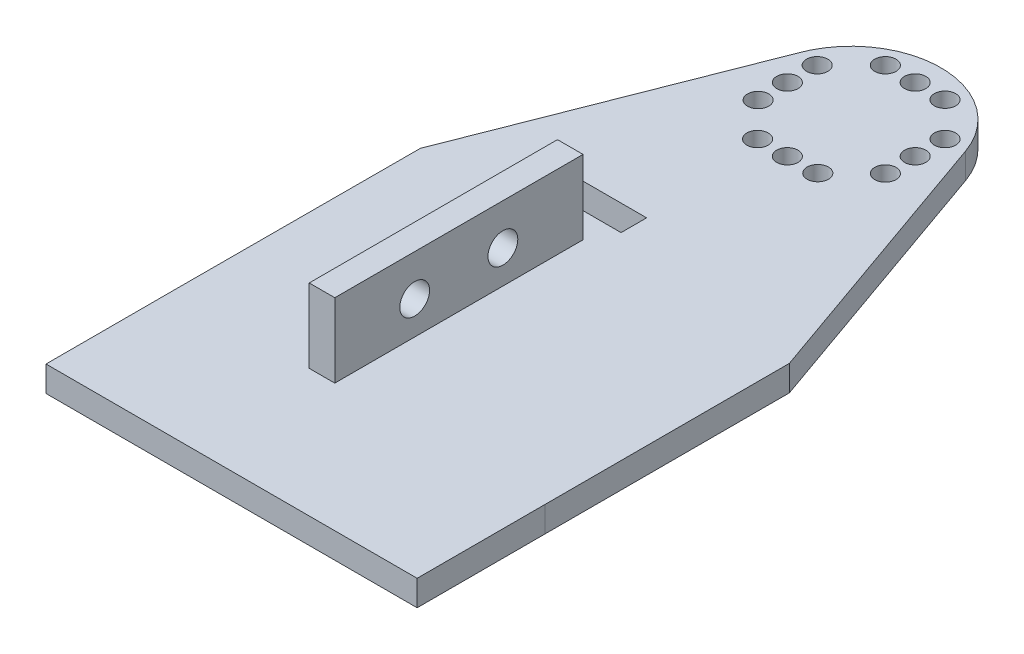
ISO-10303-21;
HEADER;
FILE_DESCRIPTION(('STEP AP214'),'2;1');
FILE_NAME('part.step','',(''),(''),'','','');
FILE_SCHEMA(('AUTOMOTIVE_DESIGN { 1 0 10303 214 1 1 1 1 }'));
ENDSEC;
DATA;
#1=APPLICATION_CONTEXT('core data for automotive mechanical design processes');
#2=APPLICATION_PROTOCOL_DEFINITION('international standard','automotive_design',2000,#1);
#3=PRODUCT_CONTEXT('',#1,'mechanical');
#4=PRODUCT('Part','Part','',(#3));
#5=PRODUCT_RELATED_PRODUCT_CATEGORY('part','',(#4));
#6=PRODUCT_DEFINITION_FORMATION('','',#4);
#7=PRODUCT_DEFINITION_CONTEXT('part definition',#1,'design');
#8=PRODUCT_DEFINITION('design','',#6,#7);
#9=PRODUCT_DEFINITION_SHAPE('','',#8);
#10=(LENGTH_UNIT() NAMED_UNIT(*) SI_UNIT(.MILLI.,.METRE.));
#11=(NAMED_UNIT(*) PLANE_ANGLE_UNIT() SI_UNIT($,.RADIAN.));
#12=(NAMED_UNIT(*) SI_UNIT($,.STERADIAN.) SOLID_ANGLE_UNIT());
#13=UNCERTAINTY_MEASURE_WITH_UNIT(LENGTH_MEASURE(1.E-05),#10,'distance_accuracy_value','');
#14=(GEOMETRIC_REPRESENTATION_CONTEXT(3) GLOBAL_UNCERTAINTY_ASSIGNED_CONTEXT((#13)) GLOBAL_UNIT_ASSIGNED_CONTEXT((#10,
#11,#12)) REPRESENTATION_CONTEXT('',''));
#15=CARTESIAN_POINT('',(0.,0.,0.));
#16=DIRECTION('',(0.,0.,1.));
#17=DIRECTION('',(1.,0.,0.));
#18=AXIS2_PLACEMENT_3D('',#15,#16,#17);
#19=CARTESIAN_POINT('',(21.1626098440634,-3.,4.90120877782623E-05));
#20=DIRECTION('',(-0.999999999997318,0.,-2.31597558804307E-06));
#21=DIRECTION('',(-2.31597558804307E-06,0.,0.999999999997318));
#22=AXIS2_PLACEMENT_3D('',#19,#20,#21);
#23=PLANE('',#22);
#24=DIRECTION('',(-2.31597558804307E-06,0.,0.999999999997318));
#25=VECTOR('',#24,1.);
#26=CARTESIAN_POINT('',(21.1626098440634,0.,4.90120877782623E-05));
#27=LINE('',#26,#25);
#28=CARTESIAN_POINT('',(21.1625440363906,0.,28.4147150215454));
#29=VERTEX_POINT('',#28);
#30=CARTESIAN_POINT('',(21.1624776148512,0.,57.0944384809703));
#31=VERTEX_POINT('',#30);
#32=EDGE_CURVE('E225',#29,#31,#27,.T.);
#33=ORIENTED_EDGE('',*,*,#32,.T.);
#34=DIRECTION('',(0.,1.,0.));
#35=VECTOR('',#34,1.);
#36=CARTESIAN_POINT('',(21.1624776148512,-3.,57.0944384809703));
#37=LINE('',#36,#35);
#38=CARTESIAN_POINT('',(21.1624776148512,-3.,57.0944384809703));
#39=VERTEX_POINT('',#38);
#40=EDGE_CURVE('E333',#39,#31,#37,.T.);
#41=ORIENTED_EDGE('',*,*,#40,.F.);
#42=DIRECTION('',(-2.31597558804307E-06,0.,0.999999999997318));
#43=VECTOR('',#42,1.);
#44=CARTESIAN_POINT('',(21.1626098440634,-3.,4.90120877782623E-05));
#45=LINE('',#44,#43);
#46=CARTESIAN_POINT('',(21.1625440363906,-3.,28.4147150215454));
#47=VERTEX_POINT('',#46);
#48=EDGE_CURVE('E234',#47,#39,#45,.T.);
#49=ORIENTED_EDGE('',*,*,#48,.F.);
#50=DIRECTION('',(0.,1.,0.));
#51=VECTOR('',#50,1.);
#52=CARTESIAN_POINT('',(21.1625440363906,-3.,28.4147150215454));
#53=LINE('',#52,#51);
#54=EDGE_CURVE('E284',#47,#29,#53,.T.);
#55=ORIENTED_EDGE('',*,*,#54,.T.);
#56=EDGE_LOOP('',(#33,#41,#49,#55));
#57=FACE_BOUND('',#56,.T.);
#58=ADVANCED_FACE('F34',(#57),#23,.F.);
#59=CARTESIAN_POINT('',(0.,-3.,57.0944384809703));
#60=DIRECTION('',(0.,0.,1.));
#61=DIRECTION('',(1.,0.,0.));
#62=AXIS2_PLACEMENT_3D('',#59,#60,#61);
#63=PLANE('',#62);
#64=DIRECTION('',(-1.,0.,0.));
#65=VECTOR('',#64,1.);
#66=CARTESIAN_POINT('',(-22.3884455960073,0.,57.0944384809703));
#67=LINE('',#66,#65);
#68=CARTESIAN_POINT('',(-3.5,0.,57.0944384809703));
#69=VERTEX_POINT('',#68);
#70=CARTESIAN_POINT('',(-6.5,0.,57.0944384809703));
#71=VERTEX_POINT('',#70);
#72=EDGE_CURVE('E11',#69,#71,#67,.T.);
#73=ORIENTED_EDGE('',*,*,#72,.F.);
#74=DIRECTION('',(0.,-1.,0.));
#75=VECTOR('',#74,1.);
#76=CARTESIAN_POINT('',(-3.5,8.68,57.0944384809703));
#77=LINE('',#76,#75);
#78=CARTESIAN_POINT('',(-3.5,8.68,57.0944384809703));
#79=VERTEX_POINT('',#78);
#80=EDGE_CURVE('E222',#79,#69,#77,.T.);
#81=ORIENTED_EDGE('',*,*,#80,.F.);
#82=DIRECTION('',(-1.,0.,0.));
#83=VECTOR('',#82,1.);
#84=CARTESIAN_POINT('',(-3.5,8.68,57.0944384809703));
#85=LINE('',#84,#83);
#86=CARTESIAN_POINT('',(-6.5,8.68,57.0944384809703));
#87=VERTEX_POINT('',#86);
#88=EDGE_CURVE('E209',#79,#87,#85,.T.);
#89=ORIENTED_EDGE('',*,*,#88,.T.);
#90=DIRECTION('',(0.,-1.,0.));
#91=VECTOR('',#90,1.);
#92=CARTESIAN_POINT('',(-6.5,8.68,57.0944384809703));
#93=LINE('',#92,#91);
#94=EDGE_CURVE('E221',#87,#71,#93,.T.);
#95=ORIENTED_EDGE('',*,*,#94,.T.);
#96=EDGE_LOOP('',(#73,#81,#89,#95));
#97=FACE_BOUND('',#96,.T.);
#98=ADVANCED_FACE('F378',(#97),#63,.T.);
#99=CARTESIAN_POINT('',(-22.2924135085874,-3.,-0.0374709514197335));
#100=DIRECTION('',(0.999998587318219,0.,0.0016808811872599));
#101=DIRECTION('',(0.0016808811872599,0.,-0.999998587318219));
#102=AXIS2_PLACEMENT_3D('',#99,#100,#101);
#103=PLANE('',#102);
#104=DIRECTION('',(0.0016808811872599,0.,-0.999998587318219));
#105=VECTOR('',#104,1.);
#106=CARTESIAN_POINT('',(-22.2924135085874,0.,-0.0374709514197335));
#107=LINE('',#106,#105);
#108=CARTESIAN_POINT('',(-22.3884455960073,0.,57.0944384809703));
#109=VERTEX_POINT('',#108);
#110=CARTESIAN_POINT('',(-22.3398978909576,0.,28.2121850324612));
#111=VERTEX_POINT('',#110);
#112=EDGE_CURVE('E296',#109,#111,#107,.T.);
#113=ORIENTED_EDGE('',*,*,#112,.T.);
#114=DIRECTION('',(0.,1.,0.));
#115=VECTOR('',#114,1.);
#116=CARTESIAN_POINT('',(-22.3398978909576,-3.,28.2121850324612));
#117=LINE('',#116,#115);
#118=CARTESIAN_POINT('',(-22.3398978909576,-3.,28.2121850324612));
#119=VERTEX_POINT('',#118);
#120=EDGE_CURVE('E339',#119,#111,#117,.T.);
#121=ORIENTED_EDGE('',*,*,#120,.F.);
#122=DIRECTION('',(0.0016808811872599,0.,-0.999998587318219));
#123=VECTOR('',#122,1.);
#124=CARTESIAN_POINT('',(-22.2924135085874,-3.,-0.0374709514197335));
#125=LINE('',#124,#123);
#126=CARTESIAN_POINT('',(-22.3884455960073,-3.,57.0944384809703));
#127=VERTEX_POINT('',#126);
#128=EDGE_CURVE('E246',#127,#119,#125,.T.);
#129=ORIENTED_EDGE('',*,*,#128,.F.);
#130=DIRECTION('',(0.,1.,0.));
#131=VECTOR('',#130,1.);
#132=CARTESIAN_POINT('',(-22.3884455960073,-3.,57.0944384809703));
#133=LINE('',#132,#131);
#134=EDGE_CURVE('E336',#127,#109,#133,.T.);
#135=ORIENTED_EDGE('',*,*,#134,.T.);
#136=EDGE_LOOP('',(#113,#121,#129,#135));
#137=FACE_BOUND('',#136,.T.);
#138=ADVANCED_FACE('F380',(#137),#103,.F.);
#139=CARTESIAN_POINT('',(-9.79827362188853,-3.,-3.8345906460047));
#140=DIRECTION('',(0.931227182902547,0.,0.364439204564198));
#141=DIRECTION('',(0.364439204564198,0.,-0.931227182902548));
#142=AXIS2_PLACEMENT_3D('',#139,#140,#141);
#143=PLANE('',#142);
#144=DIRECTION('',(0.364439204564198,0.,-0.931227182902548));
#145=VECTOR('',#144,1.);
#146=CARTESIAN_POINT('',(-9.79827362188853,0.,-3.8345906460047));
#147=LINE('',#146,#145);
#148=CARTESIAN_POINT('',(-9.92419125530451,0.,-3.51284171895391));
#149=VERTEX_POINT('',#148);
#150=EDGE_CURVE('E293',#111,#149,#147,.T.);
#151=ORIENTED_EDGE('',*,*,#150,.T.);
#152=DIRECTION('',(0.,1.,0.));
#153=VECTOR('',#152,1.);
#154=CARTESIAN_POINT('',(-9.92419125530451,-3.,-3.51284171895391));
#155=LINE('',#154,#153);
#156=CARTESIAN_POINT('',(-9.92419125530451,-3.,-3.51284171895391));
#157=VERTEX_POINT('',#156);
#158=EDGE_CURVE('E342',#157,#149,#155,.T.);
#159=ORIENTED_EDGE('',*,*,#158,.F.);
#160=DIRECTION('',(0.364439204564198,0.,-0.931227182902548));
#161=VECTOR('',#160,1.);
#162=CARTESIAN_POINT('',(-9.79827362188853,-3.,-3.8345906460047));
#163=LINE('',#162,#161);
#164=EDGE_CURVE('E244',#119,#157,#163,.T.);
#165=ORIENTED_EDGE('',*,*,#164,.F.);
#166=ORIENTED_EDGE('',*,*,#120,.T.);
#167=EDGE_LOOP('',(#151,#159,#165,#166));
#168=FACE_BOUND('',#167,.T.);
#169=ADVANCED_FACE('F386',(#168),#143,.F.);
#170=CARTESIAN_POINT('',(1.29236898960272E-13,-3.,1.6900543464704E-12));
#171=DIRECTION('',(0.,1.,0.));
#172=DIRECTION('',(0.,0.,1.));
#173=AXIS2_PLACEMENT_3D('',#170,#171,#172);
#174=CYLINDRICAL_SURFACE('',#173,10.5275651987674);
#175=CARTESIAN_POINT('',(1.29236898960272E-13,0.,1.6900543464704E-12));
#176=DIRECTION('',(0.,1.,0.));
#177=DIRECTION('',(0.,0.,1.));
#178=AXIS2_PLACEMENT_3D('',#175,#176,#177);
#179=CIRCLE('',#178,10.5275651987674);
#180=CARTESIAN_POINT('',(9.92419125531912,0.,-3.51284171891325));
#181=VERTEX_POINT('',#180);
#182=EDGE_CURVE('E290',#181,#149,#179,.T.);
#183=ORIENTED_EDGE('',*,*,#182,.F.);
#184=DIRECTION('',(0.,1.,0.));
#185=VECTOR('',#184,1.);
#186=CARTESIAN_POINT('',(9.92419125531912,-3.,-3.51284171891325));
#187=LINE('',#186,#185);
#188=CARTESIAN_POINT('',(9.92419125531912,-3.,-3.51284171891325));
#189=VERTEX_POINT('',#188);
#190=EDGE_CURVE('E344',#189,#181,#187,.T.);
#191=ORIENTED_EDGE('',*,*,#190,.F.);
#192=CARTESIAN_POINT('',(1.29236898960272E-13,-3.,1.6900543464704E-12));
#193=DIRECTION('',(0.,1.,0.));
#194=DIRECTION('',(0.,0.,1.));
#195=AXIS2_PLACEMENT_3D('',#192,#193,#194);
#196=CIRCLE('',#195,10.5275651987674);
#197=EDGE_CURVE('E241',#189,#157,#196,.T.);
#198=ORIENTED_EDGE('',*,*,#197,.T.);
#199=ORIENTED_EDGE('',*,*,#158,.T.);
#200=EDGE_LOOP('',(#183,#191,#198,#199));
#201=FACE_BOUND('',#200,.T.);
#202=ADVANCED_FACE('F396',(#201),#174,.T.);
#203=CARTESIAN_POINT('',(-7.4999892223201,-3.,-0.012714758365567));
#204=DIRECTION('',(0.,1.,0.));
#205=DIRECTION('',(0.,0.,1.));
#206=AXIS2_PLACEMENT_3D('',#203,#204,#205);
#207=CYLINDRICAL_SURFACE('',#206,1.25);
#208=CARTESIAN_POINT('',(-7.4999892223201,-3.,-0.012714758365567));
#209=DIRECTION('',(0.,1.,0.));
#210=DIRECTION('',(0.,0.,1.));
#211=AXIS2_PLACEMENT_3D('',#208,#209,#210);
#212=CIRCLE('',#211,1.25);
#213=CARTESIAN_POINT('',(-7.4999892223201,-3.,1.23728524163443));
#214=VERTEX_POINT('',#213);
#215=EDGE_CURVE('E278',#214,#214,#212,.T.);
#216=ORIENTED_EDGE('',*,*,#215,.F.);
#217=EDGE_LOOP('',(#216));
#218=FACE_BOUND('',#217,.T.);
#219=CARTESIAN_POINT('',(-7.4999892223201,0.,-0.012714758365567));
#220=DIRECTION('',(0.,1.,0.));
#221=DIRECTION('',(0.,0.,1.));
#222=AXIS2_PLACEMENT_3D('',#219,#220,#221);
#223=CIRCLE('',#222,1.25);
#224=CARTESIAN_POINT('',(-7.4999892223201,0.,1.23728524163443));
#225=VERTEX_POINT('',#224);
#226=EDGE_CURVE('E328',#225,#225,#223,.T.);
#227=ORIENTED_EDGE('',*,*,#226,.T.);
#228=EDGE_LOOP('',(#227));
#229=FACE_BOUND('',#228,.T.);
#230=ADVANCED_FACE('F399',(#218,#229),#207,.F.);
#231=CARTESIAN_POINT('',(-0.000117445511243577,-3.,-7.51284297936463));
#232=DIRECTION('',(0.,1.,0.));
#233=DIRECTION('',(0.,0.,1.));
#234=AXIS2_PLACEMENT_3D('',#231,#232,#233);
#235=CYLINDRICAL_SURFACE('',#234,1.25000000000284);
#236=CARTESIAN_POINT('',(-0.000117445511243577,-3.,-7.51284297936463));
#237=DIRECTION('',(0.,1.,0.));
#238=DIRECTION('',(0.,0.,1.));
#239=AXIS2_PLACEMENT_3D('',#236,#237,#238);
#240=CIRCLE('',#239,1.25000000000284);
#241=CARTESIAN_POINT('',(-0.000117445511243577,-3.,-6.26284297936179));
#242=VERTEX_POINT('',#241);
#243=EDGE_CURVE('E275',#242,#242,#240,.T.);
#244=ORIENTED_EDGE('',*,*,#243,.F.);
#245=EDGE_LOOP('',(#244));
#246=FACE_BOUND('',#245,.T.);
#247=CARTESIAN_POINT('',(-0.000117445511243577,0.,-7.51284297936463));
#248=DIRECTION('',(0.,1.,0.));
#249=DIRECTION('',(0.,0.,1.));
#250=AXIS2_PLACEMENT_3D('',#247,#248,#249);
#251=CIRCLE('',#250,1.25000000000284);
#252=CARTESIAN_POINT('',(-0.000117445511243577,0.,-6.26284297936179));
#253=VERTEX_POINT('',#252);
#254=EDGE_CURVE('E325',#253,#253,#251,.T.);
#255=ORIENTED_EDGE('',*,*,#254,.T.);
#256=EDGE_LOOP('',(#255));
#257=FACE_BOUND('',#256,.T.);
#258=ADVANCED_FACE('F474',(#246,#257),#235,.F.);
#259=CARTESIAN_POINT('',(7.50001077548777,-3.,-0.0129712025557176));
#260=DIRECTION('',(0.,1.,0.));
#261=DIRECTION('',(0.,0.,1.));
#262=AXIS2_PLACEMENT_3D('',#259,#260,#261);
#263=CYLINDRICAL_SURFACE('',#262,1.25000000000284);
#264=CARTESIAN_POINT('',(7.50001077548777,-3.,-0.0129712025557176));
#265=DIRECTION('',(0.,1.,0.));
#266=DIRECTION('',(0.,0.,1.));
#267=AXIS2_PLACEMENT_3D('',#264,#265,#266);
#268=CIRCLE('',#267,1.25000000000284);
#269=CARTESIAN_POINT('',(7.50001077548777,-3.,1.23702879744713));
#270=VERTEX_POINT('',#269);
#271=EDGE_CURVE('E272',#270,#270,#268,.T.);
#272=ORIENTED_EDGE('',*,*,#271,.F.);
#273=EDGE_LOOP('',(#272));
#274=FACE_BOUND('',#273,.T.);
#275=CARTESIAN_POINT('',(7.50001077548777,0.,-0.0129712025557176));
#276=DIRECTION('',(0.,1.,0.));
#277=DIRECTION('',(0.,0.,1.));
#278=AXIS2_PLACEMENT_3D('',#275,#276,#277);
#279=CIRCLE('',#278,1.25000000000284);
#280=CARTESIAN_POINT('',(7.50001077548777,0.,1.23702879744713));
#281=VERTEX_POINT('',#280);
#282=EDGE_CURVE('E322',#281,#281,#279,.T.);
#283=ORIENTED_EDGE('',*,*,#282,.T.);
#284=EDGE_LOOP('',(#283));
#285=FACE_BOUND('',#284,.T.);
#286=ADVANCED_FACE('F478',(#274,#285),#263,.F.);
#287=CARTESIAN_POINT('',(-7.42819985023391,-3.,3.48654891933226));
#288=DIRECTION('',(0.,1.,0.));
#289=DIRECTION('',(0.,0.,1.));
#290=AXIS2_PLACEMENT_3D('',#287,#288,#289);
#291=CYLINDRICAL_SURFACE('',#290,1.24999999999999);
#292=CARTESIAN_POINT('',(-7.42819985023391,-3.,3.48654891933226));
#293=DIRECTION('',(0.,1.,0.));
#294=DIRECTION('',(0.,0.,1.));
#295=AXIS2_PLACEMENT_3D('',#292,#293,#294);
#296=CIRCLE('',#295,1.24999999999999);
#297=CARTESIAN_POINT('',(-7.42819985023391,-3.,4.73654891933225));
#298=VERTEX_POINT('',#297);
#299=EDGE_CURVE('E269',#298,#298,#296,.T.);
#300=ORIENTED_EDGE('',*,*,#299,.F.);
#301=EDGE_LOOP('',(#300));
#302=FACE_BOUND('',#301,.T.);
#303=CARTESIAN_POINT('',(-7.42819985023391,0.,3.48654891933226));
#304=DIRECTION('',(0.,1.,0.));
#305=DIRECTION('',(0.,0.,1.));
#306=AXIS2_PLACEMENT_3D('',#303,#304,#305);
#307=CIRCLE('',#306,1.24999999999999);
#308=CARTESIAN_POINT('',(-7.42819985023391,0.,4.73654891933225));
#309=VERTEX_POINT('',#308);
#310=EDGE_CURVE('E319',#309,#309,#307,.T.);
#311=ORIENTED_EDGE('',*,*,#310,.T.);
#312=EDGE_LOOP('',(#311));
#313=FACE_BOUND('',#312,.T.);
#314=ADVANCED_FACE('F482',(#302,#313),#291,.F.);
#315=CARTESIAN_POINT('',(-7.5000490592978,-3.,-3.5127147578541));
#316=DIRECTION('',(0.,1.,0.));
#317=DIRECTION('',(0.,0.,1.));
#318=AXIS2_PLACEMENT_3D('',#315,#316,#317);
#319=CYLINDRICAL_SURFACE('',#318,1.25);
#320=CARTESIAN_POINT('',(-7.5000490592978,-3.,-3.5127147578541));
#321=DIRECTION('',(0.,1.,0.));
#322=DIRECTION('',(0.,0.,1.));
#323=AXIS2_PLACEMENT_3D('',#320,#321,#322);
#324=CIRCLE('',#323,1.25);
#325=CARTESIAN_POINT('',(-7.5000490592978,-3.,-2.2627147578541));
#326=VERTEX_POINT('',#325);
#327=EDGE_CURVE('E266',#326,#326,#324,.T.);
#328=ORIENTED_EDGE('',*,*,#327,.F.);
#329=EDGE_LOOP('',(#328));
#330=FACE_BOUND('',#329,.T.);
#331=CARTESIAN_POINT('',(-7.5000490592978,0.,-3.5127147578541));
#332=DIRECTION('',(0.,1.,0.));
#333=DIRECTION('',(0.,0.,1.));
#334=AXIS2_PLACEMENT_3D('',#331,#332,#333);
#335=CIRCLE('',#334,1.25);
#336=CARTESIAN_POINT('',(-7.5000490592978,0.,-2.2627147578541));
#337=VERTEX_POINT('',#336);
#338=EDGE_CURVE('E316',#337,#337,#335,.T.);
#339=ORIENTED_EDGE('',*,*,#338,.T.);
#340=EDGE_LOOP('',(#339));
#341=FACE_BOUND('',#340,.T.);
#342=ADVANCED_FACE('F486',(#330,#341),#319,.F.);
#343=CARTESIAN_POINT('',(-3.50011744499975,-3.,-7.51278314238694));
#344=DIRECTION('',(0.,1.,0.));
#345=DIRECTION('',(0.,0.,1.));
#346=AXIS2_PLACEMENT_3D('',#343,#344,#345);
#347=CYLINDRICAL_SURFACE('',#346,1.25);
#348=CARTESIAN_POINT('',(-3.50011744499975,-3.,-7.51278314238694));
#349=DIRECTION('',(0.,1.,0.));
#350=DIRECTION('',(0.,0.,1.));
#351=AXIS2_PLACEMENT_3D('',#348,#349,#350);
#352=CIRCLE('',#351,1.25);
#353=CARTESIAN_POINT('',(-3.50011744499975,-3.,-6.26278314238694));
#354=VERTEX_POINT('',#353);
#355=EDGE_CURVE('E263',#354,#354,#352,.T.);
#356=ORIENTED_EDGE('',*,*,#355,.F.);
#357=EDGE_LOOP('',(#356));
#358=FACE_BOUND('',#357,.T.);
#359=CARTESIAN_POINT('',(-3.50011744499975,0.,-7.51278314238694));
#360=DIRECTION('',(0.,1.,0.));
#361=DIRECTION('',(0.,0.,1.));
#362=AXIS2_PLACEMENT_3D('',#359,#360,#361);
#363=CIRCLE('',#362,1.25);
#364=CARTESIAN_POINT('',(-3.50011744499975,0.,-6.26278314238694));
#365=VERTEX_POINT('',#364);
#366=EDGE_CURVE('E313',#365,#365,#363,.T.);
#367=ORIENTED_EDGE('',*,*,#366,.T.);
#368=EDGE_LOOP('',(#367));
#369=FACE_BOUND('',#368,.T.);
#370=ADVANCED_FACE('F490',(#358,#369),#347,.F.);
#371=CARTESIAN_POINT('',(3.49988255397726,-3.,-7.51290281634233));
#372=DIRECTION('',(0.,1.,0.));
#373=DIRECTION('',(0.,0.,1.));
#374=AXIS2_PLACEMENT_3D('',#371,#372,#373);
#375=CYLINDRICAL_SURFACE('',#374,1.25);
#376=CARTESIAN_POINT('',(3.49988255397726,-3.,-7.51290281634233));
#377=DIRECTION('',(0.,1.,0.));
#378=DIRECTION('',(0.,0.,1.));
#379=AXIS2_PLACEMENT_3D('',#376,#377,#378);
#380=CIRCLE('',#379,1.25);
#381=CARTESIAN_POINT('',(3.49988255397726,-3.,-6.26290281634233));
#382=VERTEX_POINT('',#381);
#383=EDGE_CURVE('E260',#382,#382,#380,.T.);
#384=ORIENTED_EDGE('',*,*,#383,.F.);
#385=EDGE_LOOP('',(#384));
#386=FACE_BOUND('',#385,.T.);
#387=CARTESIAN_POINT('',(3.49988255397726,0.,-7.51290281634233));
#388=DIRECTION('',(0.,1.,0.));
#389=DIRECTION('',(0.,0.,1.));
#390=AXIS2_PLACEMENT_3D('',#387,#388,#389);
#391=CIRCLE('',#390,1.25);
#392=CARTESIAN_POINT('',(3.49988255397726,0.,-6.26290281634233));
#393=VERTEX_POINT('',#392);
#394=EDGE_CURVE('E310',#393,#393,#391,.T.);
#395=ORIENTED_EDGE('',*,*,#394,.T.);
#396=EDGE_LOOP('',(#395));
#397=FACE_BOUND('',#396,.T.);
#398=ADVANCED_FACE('F494',(#386,#397),#375,.F.);
#399=CARTESIAN_POINT('',(7.50007061246547,-3.,-3.51297120204445));
#400=DIRECTION('',(0.,1.,0.));
#401=DIRECTION('',(0.,0.,1.));
#402=AXIS2_PLACEMENT_3D('',#399,#400,#401);
#403=CYLINDRICAL_SURFACE('',#402,1.24999999999993);
#404=CARTESIAN_POINT('',(7.50007061246547,-3.,-3.51297120204445));
#405=DIRECTION('',(0.,1.,0.));
#406=DIRECTION('',(0.,0.,1.));
#407=AXIS2_PLACEMENT_3D('',#404,#405,#406);
#408=CIRCLE('',#407,1.24999999999993);
#409=CARTESIAN_POINT('',(7.50007061246547,-3.,-2.26297120204451));
#410=VERTEX_POINT('',#409);
#411=EDGE_CURVE('E257',#410,#410,#408,.T.);
#412=ORIENTED_EDGE('',*,*,#411,.F.);
#413=EDGE_LOOP('',(#412));
#414=FACE_BOUND('',#413,.T.);
#415=CARTESIAN_POINT('',(7.50007061246547,0.,-3.51297120204445));
#416=DIRECTION('',(0.,1.,0.));
#417=DIRECTION('',(0.,0.,1.));
#418=AXIS2_PLACEMENT_3D('',#415,#416,#417);
#419=CIRCLE('',#418,1.24999999999993);
#420=CARTESIAN_POINT('',(7.50007061246547,0.,-2.26297120204451));
#421=VERTEX_POINT('',#420);
#422=EDGE_CURVE('E307',#421,#421,#419,.T.);
#423=ORIENTED_EDGE('',*,*,#422,.T.);
#424=EDGE_LOOP('',(#423));
#425=FACE_BOUND('',#424,.T.);
#426=ADVANCED_FACE('F498',(#414,#425),#403,.F.);
#427=CARTESIAN_POINT('',(7.50007061246547,-3.,3.48702879693279));
#428=DIRECTION('',(0.,1.,0.));
#429=DIRECTION('',(0.,0.,1.));
#430=AXIS2_PLACEMENT_3D('',#427,#428,#429);
#431=CYLINDRICAL_SURFACE('',#430,1.25);
#432=CARTESIAN_POINT('',(7.50007061246547,-3.,3.48702879693279));
#433=DIRECTION('',(0.,1.,0.));
#434=DIRECTION('',(0.,0.,1.));
#435=AXIS2_PLACEMENT_3D('',#432,#433,#434);
#436=CIRCLE('',#435,1.25);
#437=CARTESIAN_POINT('',(7.50007061246547,-3.,4.73702879693279));
#438=VERTEX_POINT('',#437);
#439=EDGE_CURVE('E254',#438,#438,#436,.T.);
#440=ORIENTED_EDGE('',*,*,#439,.F.);
#441=EDGE_LOOP('',(#440));
#442=FACE_BOUND('',#441,.T.);
#443=CARTESIAN_POINT('',(7.50007061246547,0.,3.48702879693279));
#444=DIRECTION('',(0.,1.,0.));
#445=DIRECTION('',(0.,0.,1.));
#446=AXIS2_PLACEMENT_3D('',#443,#444,#445);
#447=CIRCLE('',#446,1.25);
#448=CARTESIAN_POINT('',(7.50007061246547,0.,4.73702879693279));
#449=VERTEX_POINT('',#448);
#450=EDGE_CURVE('E304',#449,#449,#447,.T.);
#451=ORIENTED_EDGE('',*,*,#450,.T.);
#452=EDGE_LOOP('',(#451));
#453=FACE_BOUND('',#452,.T.);
#454=ADVANCED_FACE('F502',(#442,#453),#431,.F.);
#455=CARTESIAN_POINT('',(-3.49986100080961,-3.,7.48721685542098));
#456=DIRECTION('',(0.,1.,0.));
#457=DIRECTION('',(0.,0.,1.));
#458=AXIS2_PLACEMENT_3D('',#455,#456,#457);
#459=CYLINDRICAL_SURFACE('',#458,1.25);
#460=CARTESIAN_POINT('',(-3.49986100080961,-3.,7.48721685542098));
#461=DIRECTION('',(0.,1.,0.));
#462=DIRECTION('',(0.,0.,1.));
#463=AXIS2_PLACEMENT_3D('',#460,#461,#462);
#464=CIRCLE('',#463,1.25);
#465=CARTESIAN_POINT('',(-3.49986100080961,-3.,8.73721685542098));
#466=VERTEX_POINT('',#465);
#467=EDGE_CURVE('E251',#466,#466,#464,.T.);
#468=ORIENTED_EDGE('',*,*,#467,.F.);
#469=EDGE_LOOP('',(#468));
#470=FACE_BOUND('',#469,.T.);
#471=CARTESIAN_POINT('',(-3.49986100080961,0.,7.48721685542098));
#472=DIRECTION('',(0.,1.,0.));
#473=DIRECTION('',(0.,0.,1.));
#474=AXIS2_PLACEMENT_3D('',#471,#472,#473);
#475=CIRCLE('',#474,1.25);
#476=CARTESIAN_POINT('',(-3.49986100080961,0.,8.73721685542098));
#477=VERTEX_POINT('',#476);
#478=EDGE_CURVE('E301',#477,#477,#475,.T.);
#479=ORIENTED_EDGE('',*,*,#478,.T.);
#480=EDGE_LOOP('',(#479));
#481=FACE_BOUND('',#480,.T.);
#482=ADVANCED_FACE('F412',(#470,#481),#459,.F.);
#483=CARTESIAN_POINT('',(3.49940267637675,-3.,7.4153676463571));
#484=DIRECTION('',(0.,1.,0.));
#485=DIRECTION('',(0.,0.,1.));
#486=AXIS2_PLACEMENT_3D('',#483,#484,#485);
#487=CYLINDRICAL_SURFACE('',#486,1.25);
#488=CARTESIAN_POINT('',(3.49940267637675,-3.,7.4153676463571));
#489=DIRECTION('',(0.,1.,0.));
#490=DIRECTION('',(0.,0.,1.));
#491=AXIS2_PLACEMENT_3D('',#488,#489,#490);
#492=CIRCLE('',#491,1.25);
#493=CARTESIAN_POINT('',(3.49940267637675,-3.,8.6653676463571));
#494=VERTEX_POINT('',#493);
#495=EDGE_CURVE('E248',#494,#494,#492,.T.);
#496=ORIENTED_EDGE('',*,*,#495,.F.);
#497=EDGE_LOOP('',(#496));
#498=FACE_BOUND('',#497,.T.);
#499=CARTESIAN_POINT('',(3.49940267637675,0.,7.4153676463571));
#500=DIRECTION('',(0.,1.,0.));
#501=DIRECTION('',(0.,0.,1.));
#502=AXIS2_PLACEMENT_3D('',#499,#500,#501);
#503=CIRCLE('',#502,1.25);
#504=CARTESIAN_POINT('',(3.49940267637675,0.,8.6653676463571));
#505=VERTEX_POINT('',#504);
#506=EDGE_CURVE('E298',#505,#505,#503,.T.);
#507=ORIENTED_EDGE('',*,*,#506,.T.);
#508=EDGE_LOOP('',(#507));
#509=FACE_BOUND('',#508,.T.);
#510=ADVANCED_FACE('F391',(#498,#509),#487,.F.);
#511=CARTESIAN_POINT('',(9.9303210726443,-3.,-3.49542723706961));
#512=DIRECTION('',(0.943269992134695,0.,-0.332026688593269));
#513=DIRECTION('',(-0.332026688593269,0.,-0.943269992134696));
#514=AXIS2_PLACEMENT_3D('',#511,#512,#513);
#515=PLANE('',#514);
#516=DIRECTION('',(-0.332026688593269,0.,-0.943269992134695));
#517=VECTOR('',#516,1.);
#518=CARTESIAN_POINT('',(9.9303210726443,0.,-3.49542723706961));
#519=LINE('',#518,#517);
#520=EDGE_CURVE('E287',#29,#181,#519,.T.);
#521=ORIENTED_EDGE('',*,*,#520,.F.);
#522=ORIENTED_EDGE('',*,*,#54,.F.);
#523=DIRECTION('',(-0.332026688593269,0.,-0.943269992134695));
#524=VECTOR('',#523,1.);
#525=CARTESIAN_POINT('',(9.9303210726443,-3.,-3.49542723706961));
#526=LINE('',#525,#524);
#527=EDGE_CURVE('E237',#47,#189,#526,.T.);
#528=ORIENTED_EDGE('',*,*,#527,.T.);
#529=ORIENTED_EDGE('',*,*,#190,.T.);
#530=EDGE_LOOP('',(#521,#522,#528,#529));
#531=FACE_BOUND('',#530,.T.);
#532=ADVANCED_FACE('F401',(#531),#515,.T.);
#533=CARTESIAN_POINT('',(0.000138998678897145,-3.,7.48715701844329));
#534=DIRECTION('',(0.,1.,0.));
#535=DIRECTION('',(0.,0.,1.));
#536=AXIS2_PLACEMENT_3D('',#533,#534,#535);
#537=CYLINDRICAL_SURFACE('',#536,1.25000000000284);
#538=CARTESIAN_POINT('',(0.000138998678897145,-3.,7.48715701844329));
#539=DIRECTION('',(0.,1.,0.));
#540=DIRECTION('',(0.,0.,1.));
#541=AXIS2_PLACEMENT_3D('',#538,#539,#540);
#542=CIRCLE('',#541,1.25000000000284);
#543=CARTESIAN_POINT('',(0.000138998678897145,-3.,8.73715701844613));
#544=VERTEX_POINT('',#543);
#545=EDGE_CURVE('E281',#544,#544,#542,.T.);
#546=ORIENTED_EDGE('',*,*,#545,.F.);
#547=EDGE_LOOP('',(#546));
#548=FACE_BOUND('',#547,.T.);
#549=CARTESIAN_POINT('',(0.000138998678897145,0.,7.48715701844329));
#550=DIRECTION('',(0.,1.,0.));
#551=DIRECTION('',(0.,0.,1.));
#552=AXIS2_PLACEMENT_3D('',#549,#550,#551);
#553=CIRCLE('',#552,1.25000000000284);
#554=CARTESIAN_POINT('',(0.000138998678897145,0.,8.73715701844613));
#555=VERTEX_POINT('',#554);
#556=EDGE_CURVE('E238',#555,#555,#553,.T.);
#557=ORIENTED_EDGE('',*,*,#556,.T.);
#558=EDGE_LOOP('',(#557));
#559=FACE_BOUND('',#558,.T.);
#560=ADVANCED_FACE('F403',(#548,#559),#537,.F.);
#561=CARTESIAN_POINT('',(0.,-3.,0.));
#562=DIRECTION('',(0.,1.,0.));
#563=DIRECTION('',(0.,0.,1.));
#564=AXIS2_PLACEMENT_3D('',#561,#562,#563);
#565=PLANE('',#564);
#566=DIRECTION('',(1.,0.,0.));
#567=VECTOR('',#566,1.);
#568=CARTESIAN_POINT('',(0.,-3.,25.));
#569=LINE('',#568,#567);
#570=CARTESIAN_POINT('',(-10.,-3.,25.));
#571=VERTEX_POINT('',#570);
#572=CARTESIAN_POINT('',(-2.,-3.,25.));
#573=VERTEX_POINT('',#572);
#574=EDGE_CURVE('E178',#571,#573,#569,.T.);
#575=ORIENTED_EDGE('',*,*,#574,.T.);
#576=DIRECTION('',(0.,0.,-1.));
#577=VECTOR('',#576,1.);
#578=CARTESIAN_POINT('',(-2.,-3.,0.));
#579=LINE('',#578,#577);
#580=CARTESIAN_POINT('',(-2.,-3.,22.));
#581=VERTEX_POINT('',#580);
#582=EDGE_CURVE('E181',#573,#581,#579,.T.);
#583=ORIENTED_EDGE('',*,*,#582,.T.);
#584=DIRECTION('',(-1.,0.,0.));
#585=VECTOR('',#584,1.);
#586=CARTESIAN_POINT('',(0.,-3.,22.));
#587=LINE('',#586,#585);
#588=CARTESIAN_POINT('',(-10.,-3.,22.));
#589=VERTEX_POINT('',#588);
#590=EDGE_CURVE('E173',#581,#589,#587,.T.);
#591=ORIENTED_EDGE('',*,*,#590,.T.);
#592=DIRECTION('',(0.,0.,1.));
#593=VECTOR('',#592,1.);
#594=CARTESIAN_POINT('',(-10.,-3.,0.));
#595=LINE('',#594,#593);
#596=EDGE_CURVE('E153',#589,#571,#595,.T.);
#597=ORIENTED_EDGE('',*,*,#596,.T.);
#598=EDGE_LOOP('',(#575,#583,#591,#597));
#599=FACE_BOUND('',#598,.T.);
#600=ORIENTED_EDGE('',*,*,#48,.T.);
#601=DIRECTION('',(0.,0.,-1.));
#602=VECTOR('',#601,1.);
#603=CARTESIAN_POINT('',(21.1624776148512,-3.,72.0944384809703));
#604=LINE('',#603,#602);
#605=CARTESIAN_POINT('',(21.1624776148512,-3.,72.0944384809703));
#606=VERTEX_POINT('',#605);
#607=EDGE_CURVE('E198',#606,#39,#604,.T.);
#608=ORIENTED_EDGE('',*,*,#607,.F.);
#609=DIRECTION('',(1.,0.,0.));
#610=VECTOR('',#609,1.);
#611=CARTESIAN_POINT('',(21.1624776148512,-3.,72.0944384809703));
#612=LINE('',#611,#610);
#613=CARTESIAN_POINT('',(-22.3884455960073,-3.,72.0944384809703));
#614=VERTEX_POINT('',#613);
#615=EDGE_CURVE('E187',#614,#606,#612,.T.);
#616=ORIENTED_EDGE('',*,*,#615,.F.);
#617=DIRECTION('',(0.,0.,-1.));
#618=VECTOR('',#617,1.);
#619=CARTESIAN_POINT('',(-22.3884455960073,-3.,72.0944384809703));
#620=LINE('',#619,#618);
#621=EDGE_CURVE('E200',#614,#127,#620,.T.);
#622=ORIENTED_EDGE('',*,*,#621,.T.);
#623=ORIENTED_EDGE('',*,*,#128,.T.);
#624=ORIENTED_EDGE('',*,*,#164,.T.);
#625=ORIENTED_EDGE('',*,*,#197,.F.);
#626=ORIENTED_EDGE('',*,*,#527,.F.);
#627=EDGE_LOOP('',(#600,#608,#616,#622,#623,#624,#625,#626));
#628=FACE_BOUND('',#627,.T.);
#629=ORIENTED_EDGE('',*,*,#495,.T.);
#630=EDGE_LOOP('',(#629));
#631=FACE_BOUND('',#630,.T.);
#632=ORIENTED_EDGE('',*,*,#467,.T.);
#633=EDGE_LOOP('',(#632));
#634=FACE_BOUND('',#633,.T.);
#635=ORIENTED_EDGE('',*,*,#439,.T.);
#636=EDGE_LOOP('',(#635));
#637=FACE_BOUND('',#636,.T.);
#638=ORIENTED_EDGE('',*,*,#411,.T.);
#639=EDGE_LOOP('',(#638));
#640=FACE_BOUND('',#639,.T.);
#641=ORIENTED_EDGE('',*,*,#383,.T.);
#642=EDGE_LOOP('',(#641));
#643=FACE_BOUND('',#642,.T.);
#644=ORIENTED_EDGE('',*,*,#355,.T.);
#645=EDGE_LOOP('',(#644));
#646=FACE_BOUND('',#645,.T.);
#647=ORIENTED_EDGE('',*,*,#327,.T.);
#648=EDGE_LOOP('',(#647));
#649=FACE_BOUND('',#648,.T.);
#650=ORIENTED_EDGE('',*,*,#299,.T.);
#651=EDGE_LOOP('',(#650));
#652=FACE_BOUND('',#651,.T.);
#653=ORIENTED_EDGE('',*,*,#271,.T.);
#654=EDGE_LOOP('',(#653));
#655=FACE_BOUND('',#654,.T.);
#656=ORIENTED_EDGE('',*,*,#243,.T.);
#657=EDGE_LOOP('',(#656));
#658=FACE_BOUND('',#657,.T.);
#659=ORIENTED_EDGE('',*,*,#215,.T.);
#660=EDGE_LOOP('',(#659));
#661=FACE_BOUND('',#660,.T.);
#662=ORIENTED_EDGE('',*,*,#545,.T.);
#663=EDGE_LOOP('',(#662));
#664=FACE_BOUND('',#663,.T.);
#665=ADVANCED_FACE('F409',(#599,#628,#631,#634,#637,#640,#643,#646,#649,#652,#655,#658,#661,
#664),#565,.F.);
#666=CARTESIAN_POINT('',(0.,0.,0.));
#667=DIRECTION('',(0.,1.,0.));
#668=DIRECTION('',(0.,0.,1.));
#669=AXIS2_PLACEMENT_3D('',#666,#667,#668);
#670=PLANE('',#669);
#671=DIRECTION('',(0.,0.,-1.));
#672=VECTOR('',#671,1.);
#673=CARTESIAN_POINT('',(-2.,0.,25.));
#674=LINE('',#673,#672);
#675=CARTESIAN_POINT('',(-2.,0.,25.));
#676=VERTEX_POINT('',#675);
#677=CARTESIAN_POINT('',(-2.,0.,22.));
#678=VERTEX_POINT('',#677);
#679=EDGE_CURVE('E58',#676,#678,#674,.T.);
#680=ORIENTED_EDGE('',*,*,#679,.F.);
#681=DIRECTION('',(1.,0.,0.));
#682=VECTOR('',#681,1.);
#683=CARTESIAN_POINT('',(-10.,0.,25.));
#684=LINE('',#683,#682);
#685=CARTESIAN_POINT('',(-10.,0.,25.));
#686=VERTEX_POINT('',#685);
#687=EDGE_CURVE('E166',#686,#676,#684,.T.);
#688=ORIENTED_EDGE('',*,*,#687,.F.);
#689=DIRECTION('',(0.,0.,1.));
#690=VECTOR('',#689,1.);
#691=CARTESIAN_POINT('',(-10.,0.,22.));
#692=LINE('',#691,#690);
#693=CARTESIAN_POINT('',(-10.,0.,22.));
#694=VERTEX_POINT('',#693);
#695=EDGE_CURVE('E150',#694,#686,#692,.T.);
#696=ORIENTED_EDGE('',*,*,#695,.F.);
#697=DIRECTION('',(-1.,0.,0.));
#698=VECTOR('',#697,1.);
#699=CARTESIAN_POINT('',(-2.,0.,22.));
#700=LINE('',#699,#698);
#701=EDGE_CURVE('E159',#678,#694,#700,.T.);
#702=ORIENTED_EDGE('',*,*,#701,.F.);
#703=EDGE_LOOP('',(#680,#688,#696,#702));
#704=FACE_BOUND('',#703,.T.);
#705=DIRECTION('',(0.,0.,-1.));
#706=VECTOR('',#705,1.);
#707=CARTESIAN_POINT('',(21.1624776148512,0.,72.0944384809703));
#708=LINE('',#707,#706);
#709=CARTESIAN_POINT('',(21.1624776148512,0.,72.0944384809703));
#710=VERTEX_POINT('',#709);
#711=EDGE_CURVE('E195',#710,#31,#708,.T.);
#712=ORIENTED_EDGE('',*,*,#711,.T.);
#713=ORIENTED_EDGE('',*,*,#32,.F.);
#714=ORIENTED_EDGE('',*,*,#520,.T.);
#715=ORIENTED_EDGE('',*,*,#182,.T.);
#716=ORIENTED_EDGE('',*,*,#150,.F.);
#717=ORIENTED_EDGE('',*,*,#112,.F.);
#718=DIRECTION('',(0.,0.,-1.));
#719=VECTOR('',#718,1.);
#720=CARTESIAN_POINT('',(-22.3884455960073,0.,72.0944384809703));
#721=LINE('',#720,#719);
#722=CARTESIAN_POINT('',(-22.3884455960073,0.,72.0944384809703));
#723=VERTEX_POINT('',#722);
#724=EDGE_CURVE('E192',#723,#109,#721,.T.);
#725=ORIENTED_EDGE('',*,*,#724,.F.);
#726=DIRECTION('',(-1.,0.,0.));
#727=VECTOR('',#726,1.);
#728=CARTESIAN_POINT('',(-3.5,0.,72.0944384809703));
#729=LINE('',#728,#727);
#730=EDGE_CURVE('E191',#710,#723,#729,.T.);
#731=ORIENTED_EDGE('',*,*,#730,.F.);
#732=EDGE_LOOP('',(#712,#713,#714,#715,#716,#717,#725,#731));
#733=FACE_BOUND('',#732,.T.);
#734=DIRECTION('',(0.,0.,-1.));
#735=VECTOR('',#734,1.);
#736=CARTESIAN_POINT('',(-3.5,0.,0.));
#737=LINE('',#736,#735);
#738=CARTESIAN_POINT('',(-3.5,0.,27.9644392610414));
#739=VERTEX_POINT('',#738);
#740=EDGE_CURVE('E42',#69,#739,#737,.T.);
#741=ORIENTED_EDGE('',*,*,#740,.F.);
#742=ORIENTED_EDGE('',*,*,#72,.T.);
#743=DIRECTION('',(0.,0.,1.));
#744=VECTOR('',#743,1.);
#745=CARTESIAN_POINT('',(-6.49999999999999,0.,0.));
#746=LINE('',#745,#744);
#747=CARTESIAN_POINT('',(-6.5,0.,27.9644392610414));
#748=VERTEX_POINT('',#747);
#749=EDGE_CURVE('E335',#748,#71,#746,.T.);
#750=ORIENTED_EDGE('',*,*,#749,.F.);
#751=DIRECTION('',(-1.,0.,0.));
#752=VECTOR('',#751,1.);
#753=CARTESIAN_POINT('',(0.,0.,27.9644392610414));
#754=LINE('',#753,#752);
#755=EDGE_CURVE('E349',#739,#748,#754,.T.);
#756=ORIENTED_EDGE('',*,*,#755,.F.);
#757=EDGE_LOOP('',(#741,#742,#750,#756));
#758=FACE_BOUND('',#757,.T.);
#759=ORIENTED_EDGE('',*,*,#506,.F.);
#760=EDGE_LOOP('',(#759));
#761=FACE_BOUND('',#760,.T.);
#762=ORIENTED_EDGE('',*,*,#478,.F.);
#763=EDGE_LOOP('',(#762));
#764=FACE_BOUND('',#763,.T.);
#765=ORIENTED_EDGE('',*,*,#450,.F.);
#766=EDGE_LOOP('',(#765));
#767=FACE_BOUND('',#766,.T.);
#768=ORIENTED_EDGE('',*,*,#422,.F.);
#769=EDGE_LOOP('',(#768));
#770=FACE_BOUND('',#769,.T.);
#771=ORIENTED_EDGE('',*,*,#394,.F.);
#772=EDGE_LOOP('',(#771));
#773=FACE_BOUND('',#772,.T.);
#774=ORIENTED_EDGE('',*,*,#366,.F.);
#775=EDGE_LOOP('',(#774));
#776=FACE_BOUND('',#775,.T.);
#777=ORIENTED_EDGE('',*,*,#338,.F.);
#778=EDGE_LOOP('',(#777));
#779=FACE_BOUND('',#778,.T.);
#780=ORIENTED_EDGE('',*,*,#310,.F.);
#781=EDGE_LOOP('',(#780));
#782=FACE_BOUND('',#781,.T.);
#783=ORIENTED_EDGE('',*,*,#282,.F.);
#784=EDGE_LOOP('',(#783));
#785=FACE_BOUND('',#784,.T.);
#786=ORIENTED_EDGE('',*,*,#254,.F.);
#787=EDGE_LOOP('',(#786));
#788=FACE_BOUND('',#787,.T.);
#789=ORIENTED_EDGE('',*,*,#226,.F.);
#790=EDGE_LOOP('',(#789));
#791=FACE_BOUND('',#790,.T.);
#792=ORIENTED_EDGE('',*,*,#556,.F.);
#793=EDGE_LOOP('',(#792));
#794=FACE_BOUND('',#793,.T.);
#795=ADVANCED_FACE('F163',(#704,#733,#758,#761,#764,#767,#770,#773,#776,#779,#782,#785,#788,
#791,#794),#670,.T.);
#796=CARTESIAN_POINT('',(-3.5,8.68,27.9644392610414));
#797=DIRECTION('',(1.,0.,0.));
#798=DIRECTION('',(0.,0.,-1.));
#799=AXIS2_PLACEMENT_3D('',#796,#797,#798);
#800=PLANE('',#799);
#801=CARTESIAN_POINT('',(-3.5,3.88,47.7194392610414));
#802=DIRECTION('',(1.,0.,0.));
#803=DIRECTION('',(0.,0.,-1.));
#804=AXIS2_PLACEMENT_3D('',#801,#802,#803);
#805=CIRCLE('',#804,1.75);
#806=CARTESIAN_POINT('',(-3.5,3.88,45.9694392610414));
#807=VERTEX_POINT('',#806);
#808=EDGE_CURVE('E202',#807,#807,#805,.T.);
#809=ORIENTED_EDGE('',*,*,#808,.F.);
#810=EDGE_LOOP('',(#809));
#811=FACE_BOUND('',#810,.T.);
#812=CARTESIAN_POINT('',(-3.5,3.88,37.3694392610414));
#813=DIRECTION('',(1.,0.,0.));
#814=DIRECTION('',(0.,0.,-1.));
#815=AXIS2_PLACEMENT_3D('',#812,#813,#814);
#816=CIRCLE('',#815,1.75000000025897);
#817=CARTESIAN_POINT('',(-3.5,3.88,35.6194392607825));
#818=VERTEX_POINT('',#817);
#819=EDGE_CURVE('E205',#818,#818,#816,.T.);
#820=ORIENTED_EDGE('',*,*,#819,.F.);
#821=EDGE_LOOP('',(#820));
#822=FACE_BOUND('',#821,.T.);
#823=ORIENTED_EDGE('',*,*,#80,.T.);
#824=ORIENTED_EDGE('',*,*,#740,.T.);
#825=DIRECTION('',(0.,-1.,0.));
#826=VECTOR('',#825,1.);
#827=CARTESIAN_POINT('',(-3.5,8.68,27.9644392610414));
#828=LINE('',#827,#826);
#829=CARTESIAN_POINT('',(-3.5,8.68,27.9644392610414));
#830=VERTEX_POINT('',#829);
#831=EDGE_CURVE('E226',#830,#739,#828,.T.);
#832=ORIENTED_EDGE('',*,*,#831,.F.);
#833=DIRECTION('',(0.,0.,1.));
#834=VECTOR('',#833,1.);
#835=CARTESIAN_POINT('',(-3.5,8.68,27.9644392610414));
#836=LINE('',#835,#834);
#837=EDGE_CURVE('E218',#830,#79,#836,.T.);
#838=ORIENTED_EDGE('',*,*,#837,.T.);
#839=EDGE_LOOP('',(#823,#824,#832,#838));
#840=FACE_BOUND('',#839,.T.);
#841=ADVANCED_FACE('F373',(#811,#822,#840),#800,.T.);
#842=CARTESIAN_POINT('',(-6.5,8.68,27.9644392610414));
#843=DIRECTION('',(0.,0.,-1.));
#844=DIRECTION('',(-1.,0.,0.));
#845=AXIS2_PLACEMENT_3D('',#842,#843,#844);
#846=PLANE('',#845);
#847=ORIENTED_EDGE('',*,*,#831,.T.);
#848=ORIENTED_EDGE('',*,*,#755,.T.);
#849=DIRECTION('',(0.,-1.,0.));
#850=VECTOR('',#849,1.);
#851=CARTESIAN_POINT('',(-6.5,8.68,27.9644392610414));
#852=LINE('',#851,#850);
#853=CARTESIAN_POINT('',(-6.5,8.68,27.9644392610414));
#854=VERTEX_POINT('',#853);
#855=EDGE_CURVE('E229',#854,#748,#852,.T.);
#856=ORIENTED_EDGE('',*,*,#855,.F.);
#857=DIRECTION('',(1.,0.,0.));
#858=VECTOR('',#857,1.);
#859=CARTESIAN_POINT('',(-6.5,8.68,27.9644392610414));
#860=LINE('',#859,#858);
#861=EDGE_CURVE('E215',#854,#830,#860,.T.);
#862=ORIENTED_EDGE('',*,*,#861,.T.);
#863=EDGE_LOOP('',(#847,#848,#856,#862));
#864=FACE_BOUND('',#863,.T.);
#865=ADVANCED_FACE('F363',(#864),#846,.T.);
#866=CARTESIAN_POINT('',(-6.5,8.68,57.0944384809703));
#867=DIRECTION('',(-1.,0.,0.));
#868=DIRECTION('',(0.,0.,1.));
#869=AXIS2_PLACEMENT_3D('',#866,#867,#868);
#870=PLANE('',#869);
#871=CARTESIAN_POINT('',(-6.5,3.88,47.7194392610414));
#872=DIRECTION('',(-1.,0.,0.));
#873=DIRECTION('',(0.,0.,1.));
#874=AXIS2_PLACEMENT_3D('',#871,#872,#873);
#875=CIRCLE('',#874,1.75);
#876=CARTESIAN_POINT('',(-6.5,3.88,49.4694392610414));
#877=VERTEX_POINT('',#876);
#878=EDGE_CURVE('E37',#877,#877,#875,.T.);
#879=ORIENTED_EDGE('',*,*,#878,.F.);
#880=EDGE_LOOP('',(#879));
#881=FACE_BOUND('',#880,.T.);
#882=CARTESIAN_POINT('',(-6.5,3.88,37.3694392610414));
#883=DIRECTION('',(-1.,0.,0.));
#884=DIRECTION('',(0.,0.,1.));
#885=AXIS2_PLACEMENT_3D('',#882,#883,#884);
#886=CIRCLE('',#885,1.75000000025897);
#887=CARTESIAN_POINT('',(-6.5,3.88,39.1194392613004));
#888=VERTEX_POINT('',#887);
#889=EDGE_CURVE('E208',#888,#888,#886,.T.);
#890=ORIENTED_EDGE('',*,*,#889,.F.);
#891=EDGE_LOOP('',(#890));
#892=FACE_BOUND('',#891,.T.);
#893=ORIENTED_EDGE('',*,*,#855,.T.);
#894=ORIENTED_EDGE('',*,*,#749,.T.);
#895=ORIENTED_EDGE('',*,*,#94,.F.);
#896=DIRECTION('',(0.,0.,-1.));
#897=VECTOR('',#896,1.);
#898=CARTESIAN_POINT('',(-6.5,8.68,57.0944384809703));
#899=LINE('',#898,#897);
#900=EDGE_CURVE('E212',#87,#854,#899,.T.);
#901=ORIENTED_EDGE('',*,*,#900,.T.);
#902=EDGE_LOOP('',(#893,#894,#895,#901));
#903=FACE_BOUND('',#902,.T.);
#904=ADVANCED_FACE('F359',(#881,#892,#903),#870,.T.);
#905=CARTESIAN_POINT('',(0.,8.68,0.));
#906=DIRECTION('',(0.,-1.,0.));
#907=DIRECTION('',(0.,0.,-1.));
#908=AXIS2_PLACEMENT_3D('',#905,#906,#907);
#909=PLANE('',#908);
#910=ORIENTED_EDGE('',*,*,#88,.F.);
#911=ORIENTED_EDGE('',*,*,#837,.F.);
#912=ORIENTED_EDGE('',*,*,#861,.F.);
#913=ORIENTED_EDGE('',*,*,#900,.F.);
#914=EDGE_LOOP('',(#910,#911,#912,#913));
#915=FACE_BOUND('',#914,.T.);
#916=ADVANCED_FACE('F362',(#915),#909,.F.);
#917=CARTESIAN_POINT('',(-8.5,3.88,37.3694392610414));
#918=DIRECTION('',(1.,0.,0.));
#919=DIRECTION('',(0.,0.,-1.));
#920=AXIS2_PLACEMENT_3D('',#917,#918,#919);
#921=CYLINDRICAL_SURFACE('',#920,1.75000000025897);
#922=ORIENTED_EDGE('',*,*,#889,.T.);
#923=EDGE_LOOP('',(#922));
#924=FACE_BOUND('',#923,.T.);
#925=ORIENTED_EDGE('',*,*,#819,.T.);
#926=EDGE_LOOP('',(#925));
#927=FACE_BOUND('',#926,.T.);
#928=ADVANCED_FACE('F356',(#924,#927),#921,.F.);
#929=CARTESIAN_POINT('',(-8.5,3.88,47.7194392610414));
#930=DIRECTION('',(1.,0.,0.));
#931=DIRECTION('',(0.,0.,-1.));
#932=AXIS2_PLACEMENT_3D('',#929,#930,#931);
#933=CYLINDRICAL_SURFACE('',#932,1.75);
#934=ORIENTED_EDGE('',*,*,#878,.T.);
#935=EDGE_LOOP('',(#934));
#936=FACE_BOUND('',#935,.T.);
#937=ORIENTED_EDGE('',*,*,#808,.T.);
#938=EDGE_LOOP('',(#937));
#939=FACE_BOUND('',#938,.T.);
#940=ADVANCED_FACE('F451',(#936,#939),#933,.F.);
#941=CARTESIAN_POINT('',(-22.3884455960073,-3.,72.0944384809703));
#942=DIRECTION('',(1.,0.,0.));
#943=DIRECTION('',(0.,0.,-1.));
#944=AXIS2_PLACEMENT_3D('',#941,#942,#943);
#945=PLANE('',#944);
#946=ORIENTED_EDGE('',*,*,#134,.F.);
#947=ORIENTED_EDGE('',*,*,#621,.F.);
#948=DIRECTION('',(0.,-1.,0.));
#949=VECTOR('',#948,1.);
#950=CARTESIAN_POINT('',(-22.3884455960073,-3.,72.0944384809703));
#951=LINE('',#950,#949);
#952=EDGE_CURVE('E184',#723,#614,#951,.T.);
#953=ORIENTED_EDGE('',*,*,#952,.F.);
#954=ORIENTED_EDGE('',*,*,#724,.T.);
#955=EDGE_LOOP('',(#946,#947,#953,#954));
#956=FACE_BOUND('',#955,.T.);
#957=ADVANCED_FACE('F437',(#956),#945,.F.);
#958=CARTESIAN_POINT('',(21.1624776148512,0.,72.0944384809703));
#959=DIRECTION('',(-1.,0.,0.));
#960=DIRECTION('',(0.,0.,1.));
#961=AXIS2_PLACEMENT_3D('',#958,#959,#960);
#962=PLANE('',#961);
#963=ORIENTED_EDGE('',*,*,#40,.T.);
#964=ORIENTED_EDGE('',*,*,#711,.F.);
#965=DIRECTION('',(0.,1.,0.));
#966=VECTOR('',#965,1.);
#967=CARTESIAN_POINT('',(21.1624776148512,0.,72.0944384809703));
#968=LINE('',#967,#966);
#969=EDGE_CURVE('E189',#606,#710,#968,.T.);
#970=ORIENTED_EDGE('',*,*,#969,.F.);
#971=ORIENTED_EDGE('',*,*,#607,.T.);
#972=EDGE_LOOP('',(#963,#964,#970,#971));
#973=FACE_BOUND('',#972,.T.);
#974=ADVANCED_FACE('F442',(#973),#962,.F.);
#975=CARTESIAN_POINT('',(0.,0.,72.0944384809703));
#976=DIRECTION('',(0.,0.,-1.));
#977=DIRECTION('',(-1.,0.,0.));
#978=AXIS2_PLACEMENT_3D('',#975,#976,#977);
#979=PLANE('',#978);
#980=ORIENTED_EDGE('',*,*,#952,.T.);
#981=ORIENTED_EDGE('',*,*,#615,.T.);
#982=ORIENTED_EDGE('',*,*,#969,.T.);
#983=ORIENTED_EDGE('',*,*,#730,.T.);
#984=EDGE_LOOP('',(#980,#981,#982,#983));
#985=FACE_BOUND('',#984,.T.);
#986=ADVANCED_FACE('F439',(#985),#979,.F.);
#987=CARTESIAN_POINT('',(-2.,-10.,25.));
#988=DIRECTION('',(1.,0.,0.));
#989=DIRECTION('',(0.,0.,-1.));
#990=AXIS2_PLACEMENT_3D('',#987,#988,#989);
#991=PLANE('',#990);
#992=DIRECTION('',(0.,1.,0.));
#993=VECTOR('',#992,1.);
#994=CARTESIAN_POINT('',(-2.,-10.,25.));
#995=LINE('',#994,#993);
#996=EDGE_CURVE('E171',#573,#676,#995,.T.);
#997=ORIENTED_EDGE('',*,*,#996,.T.);
#998=ORIENTED_EDGE('',*,*,#679,.T.);
#999=DIRECTION('',(0.,1.,0.));
#1000=VECTOR('',#999,1.);
#1001=CARTESIAN_POINT('',(-2.,-10.,22.));
#1002=LINE('',#1001,#1000);
#1003=EDGE_CURVE('E156',#581,#678,#1002,.T.);
#1004=ORIENTED_EDGE('',*,*,#1003,.F.);
#1005=ORIENTED_EDGE('',*,*,#582,.F.);
#1006=EDGE_LOOP('',(#997,#998,#1004,#1005));
#1007=FACE_BOUND('',#1006,.T.);
#1008=ADVANCED_FACE('F449',(#1007),#991,.F.);
#1009=CARTESIAN_POINT('',(-10.,-10.,25.));
#1010=DIRECTION('',(0.,0.,1.));
#1011=DIRECTION('',(1.,0.,0.));
#1012=AXIS2_PLACEMENT_3D('',#1009,#1010,#1011);
#1013=PLANE('',#1012);
#1014=DIRECTION('',(0.,1.,0.));
#1015=VECTOR('',#1014,1.);
#1016=CARTESIAN_POINT('',(-10.,-10.,25.));
#1017=LINE('',#1016,#1015);
#1018=EDGE_CURVE('E155',#571,#686,#1017,.T.);
#1019=ORIENTED_EDGE('',*,*,#1018,.T.);
#1020=ORIENTED_EDGE('',*,*,#687,.T.);
#1021=ORIENTED_EDGE('',*,*,#996,.F.);
#1022=ORIENTED_EDGE('',*,*,#574,.F.);
#1023=EDGE_LOOP('',(#1019,#1020,#1021,#1022));
#1024=FACE_BOUND('',#1023,.T.);
#1025=ADVANCED_FACE('F677',(#1024),#1013,.F.);
#1026=CARTESIAN_POINT('',(-10.,-10.,22.));
#1027=DIRECTION('',(-1.,0.,0.));
#1028=DIRECTION('',(0.,0.,1.));
#1029=AXIS2_PLACEMENT_3D('',#1026,#1027,#1028);
#1030=PLANE('',#1029);
#1031=DIRECTION('',(0.,1.,0.));
#1032=VECTOR('',#1031,1.);
#1033=CARTESIAN_POINT('',(-10.,-10.,22.));
#1034=LINE('',#1033,#1032);
#1035=EDGE_CURVE('E50',#589,#694,#1034,.T.);
#1036=ORIENTED_EDGE('',*,*,#1035,.T.);
#1037=ORIENTED_EDGE('',*,*,#695,.T.);
#1038=ORIENTED_EDGE('',*,*,#1018,.F.);
#1039=ORIENTED_EDGE('',*,*,#596,.F.);
#1040=EDGE_LOOP('',(#1036,#1037,#1038,#1039));
#1041=FACE_BOUND('',#1040,.T.);
#1042=ADVANCED_FACE('F147',(#1041),#1030,.F.);
#1043=CARTESIAN_POINT('',(-2.,-10.,22.));
#1044=DIRECTION('',(0.,0.,-1.));
#1045=DIRECTION('',(-1.,0.,0.));
#1046=AXIS2_PLACEMENT_3D('',#1043,#1044,#1045);
#1047=PLANE('',#1046);
#1048=ORIENTED_EDGE('',*,*,#1003,.T.);
#1049=ORIENTED_EDGE('',*,*,#701,.T.);
#1050=ORIENTED_EDGE('',*,*,#1035,.F.);
#1051=ORIENTED_EDGE('',*,*,#590,.F.);
#1052=EDGE_LOOP('',(#1048,#1049,#1050,#1051));
#1053=FACE_BOUND('',#1052,.T.);
#1054=ADVANCED_FACE('F160',(#1053),#1047,.F.);
#1055=CLOSED_SHELL('',(#58,#98,#138,#169,#202,#230,#258,#286,#314,#342,#370,#398,#426,#454,#482,
#510,#532,#560,#665,#795,#841,#865,#904,#916,#928,#940,#957,#974,#986,#1008,#1025,#1042,#1054));
#1056=MANIFOLD_SOLID_BREP('B2',#1055);
#1057=ADVANCED_BREP_SHAPE_REPRESENTATION('',(#18,#1056),#14);
#1058=SHAPE_DEFINITION_REPRESENTATION(#9,#1057);
ENDSEC;
END-ISO-10303-21;
